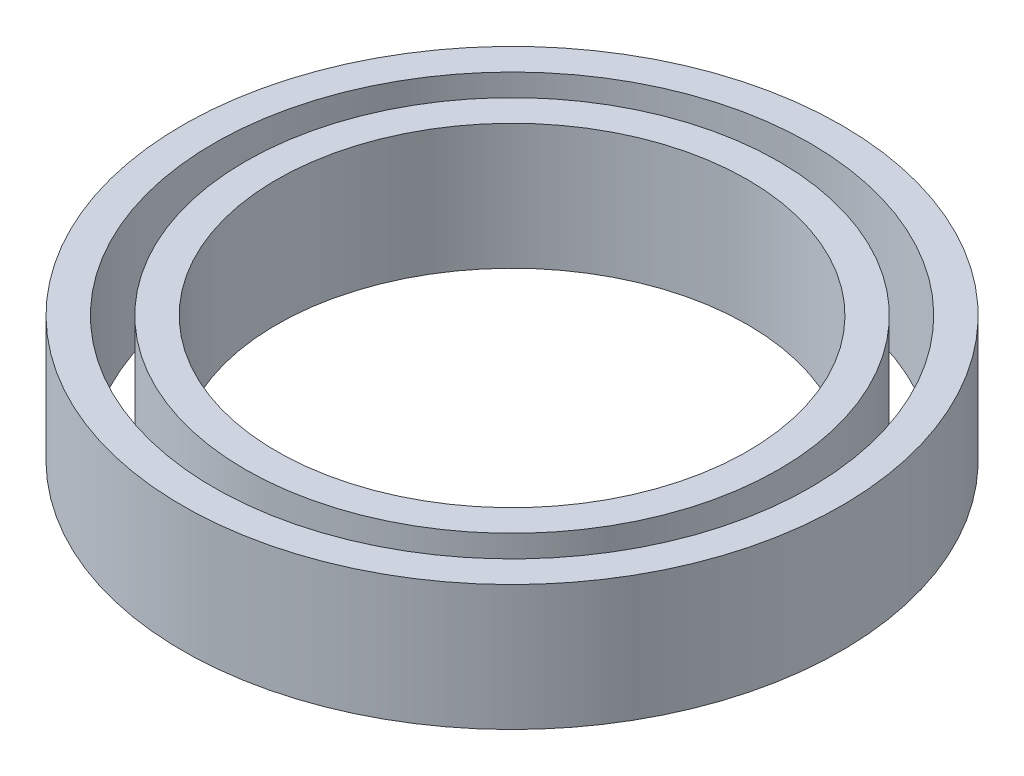
ISO-10303-21;
HEADER;
FILE_DESCRIPTION(('STEP AP214'),'2;1');
FILE_NAME('part.step','',(''),(''),'','','');
FILE_SCHEMA(('AUTOMOTIVE_DESIGN { 1 0 10303 214 1 1 1 1 }'));
ENDSEC;
DATA;
#1=APPLICATION_CONTEXT('core data for automotive mechanical design processes');
#2=APPLICATION_PROTOCOL_DEFINITION('international standard','automotive_design',2000,#1);
#3=PRODUCT_CONTEXT('',#1,'mechanical');
#4=PRODUCT('Part','Part','',(#3));
#5=PRODUCT_RELATED_PRODUCT_CATEGORY('part','',(#4));
#6=PRODUCT_DEFINITION_FORMATION('','',#4);
#7=PRODUCT_DEFINITION_CONTEXT('part definition',#1,'design');
#8=PRODUCT_DEFINITION('design','',#6,#7);
#9=PRODUCT_DEFINITION_SHAPE('','',#8);
#10=(LENGTH_UNIT() NAMED_UNIT(*) SI_UNIT(.MILLI.,.METRE.));
#11=(NAMED_UNIT(*) PLANE_ANGLE_UNIT() SI_UNIT($,.RADIAN.));
#12=(NAMED_UNIT(*) SI_UNIT($,.STERADIAN.) SOLID_ANGLE_UNIT());
#13=UNCERTAINTY_MEASURE_WITH_UNIT(LENGTH_MEASURE(1.E-05),#10,'distance_accuracy_value','');
#14=(GEOMETRIC_REPRESENTATION_CONTEXT(3) GLOBAL_UNCERTAINTY_ASSIGNED_CONTEXT((#13)) GLOBAL_UNIT_ASSIGNED_CONTEXT((#10,
#11,#12)) REPRESENTATION_CONTEXT('',''));
#15=CARTESIAN_POINT('',(0.,0.,0.));
#16=DIRECTION('',(0.,0.,1.));
#17=DIRECTION('',(1.,0.,0.));
#18=AXIS2_PLACEMENT_3D('',#15,#16,#17);
#19=CARTESIAN_POINT('',(0.,0.,0.));
#20=DIRECTION('',(0.,-1.,0.));
#21=DIRECTION('',(0.,0.,-1.));
#22=AXIS2_PLACEMENT_3D('',#19,#20,#21);
#23=CYLINDRICAL_SURFACE('',#22,9.5);
#24=CARTESIAN_POINT('',(0.,0.,0.));
#25=DIRECTION('',(0.,-1.,0.));
#26=DIRECTION('',(0.,0.,-1.));
#27=AXIS2_PLACEMENT_3D('',#24,#25,#26);
#28=CIRCLE('',#27,9.5);
#29=CARTESIAN_POINT('',(0.,0.,-9.5));
#30=VERTEX_POINT('',#29);
#31=EDGE_CURVE('E59',#30,#30,#28,.T.);
#32=ORIENTED_EDGE('',*,*,#31,.T.);
#33=EDGE_LOOP('',(#32));
#34=FACE_BOUND('',#33,.T.);
#35=CARTESIAN_POINT('',(0.,4.,0.));
#36=DIRECTION('',(0.,-1.,0.));
#37=DIRECTION('',(0.,0.,-1.));
#38=AXIS2_PLACEMENT_3D('',#35,#36,#37);
#39=CIRCLE('',#38,9.5);
#40=CARTESIAN_POINT('',(0.,4.,-9.5));
#41=VERTEX_POINT('',#40);
#42=EDGE_CURVE('E11',#41,#41,#39,.T.);
#43=ORIENTED_EDGE('',*,*,#42,.F.);
#44=EDGE_LOOP('',(#43));
#45=FACE_BOUND('',#44,.T.);
#46=ADVANCED_FACE('F45',(#34,#45),#23,.F.);
#47=CARTESIAN_POINT('',(9.5,4.,0.));
#48=DIRECTION('',(0.,1.,0.));
#49=DIRECTION('',(0.,0.,1.));
#50=AXIS2_PLACEMENT_3D('',#47,#48,#49);
#51=PLANE('',#50);
#52=ORIENTED_EDGE('',*,*,#42,.T.);
#53=EDGE_LOOP('',(#52));
#54=FACE_BOUND('',#53,.T.);
#55=CARTESIAN_POINT('',(0.,4.,0.));
#56=DIRECTION('',(0.,-1.,0.));
#57=DIRECTION('',(0.,0.,-1.));
#58=AXIS2_PLACEMENT_3D('',#55,#56,#57);
#59=CIRCLE('',#58,10.5);
#60=CARTESIAN_POINT('',(0.,4.,-10.5));
#61=VERTEX_POINT('',#60);
#62=EDGE_CURVE('E51',#61,#61,#59,.T.);
#63=ORIENTED_EDGE('',*,*,#62,.F.);
#64=EDGE_LOOP('',(#63));
#65=FACE_BOUND('',#64,.T.);
#66=ADVANCED_FACE('F75',(#54,#65),#51,.T.);
#67=CARTESIAN_POINT('',(0.,0.,0.));
#68=DIRECTION('',(0.,-1.,0.));
#69=DIRECTION('',(0.,0.,-1.));
#70=AXIS2_PLACEMENT_3D('',#67,#68,#69);
#71=CYLINDRICAL_SURFACE('',#70,10.5);
#72=ORIENTED_EDGE('',*,*,#62,.T.);
#73=EDGE_LOOP('',(#72));
#74=FACE_BOUND('',#73,.T.);
#75=CARTESIAN_POINT('',(0.,0.,0.));
#76=DIRECTION('',(0.,-1.,0.));
#77=DIRECTION('',(0.,0.,-1.));
#78=AXIS2_PLACEMENT_3D('',#75,#76,#77);
#79=CIRCLE('',#78,10.5);
#80=CARTESIAN_POINT('',(0.,0.,-10.5));
#81=VERTEX_POINT('',#80);
#82=EDGE_CURVE('E55',#81,#81,#79,.T.);
#83=ORIENTED_EDGE('',*,*,#82,.F.);
#84=EDGE_LOOP('',(#83));
#85=FACE_BOUND('',#84,.T.);
#86=ADVANCED_FACE('F69',(#74,#85),#71,.T.);
#87=CARTESIAN_POINT('',(9.5,0.,0.));
#88=DIRECTION('',(0.,-1.,0.));
#89=DIRECTION('',(0.,0.,-1.));
#90=AXIS2_PLACEMENT_3D('',#87,#88,#89);
#91=PLANE('',#90);
#92=ORIENTED_EDGE('',*,*,#82,.T.);
#93=EDGE_LOOP('',(#92));
#94=FACE_BOUND('',#93,.T.);
#95=ORIENTED_EDGE('',*,*,#31,.F.);
#96=EDGE_LOOP('',(#95));
#97=FACE_BOUND('',#96,.T.);
#98=ADVANCED_FACE('F67',(#94,#97),#91,.T.);
#99=CLOSED_SHELL('',(#46,#66,#86,#98));
#100=MANIFOLD_SOLID_BREP('B2',#99);
#101=CARTESIAN_POINT('',(0.,0.,0.));
#102=DIRECTION('',(0.,-1.,0.));
#103=DIRECTION('',(0.,0.,-1.));
#104=AXIS2_PLACEMENT_3D('',#101,#102,#103);
#105=CYLINDRICAL_SURFACE('',#104,7.5);
#106=CARTESIAN_POINT('',(0.,0.,0.));
#107=DIRECTION('',(0.,-1.,0.));
#108=DIRECTION('',(0.,0.,-1.));
#109=AXIS2_PLACEMENT_3D('',#106,#107,#108);
#110=CIRCLE('',#109,7.5);
#111=CARTESIAN_POINT('',(0.,0.,-7.5));
#112=VERTEX_POINT('',#111);
#113=EDGE_CURVE('E121',#112,#112,#110,.T.);
#114=ORIENTED_EDGE('',*,*,#113,.T.);
#115=EDGE_LOOP('',(#114));
#116=FACE_BOUND('',#115,.T.);
#117=CARTESIAN_POINT('',(0.,4.,0.));
#118=DIRECTION('',(0.,-1.,0.));
#119=DIRECTION('',(0.,0.,-1.));
#120=AXIS2_PLACEMENT_3D('',#117,#118,#119);
#121=CIRCLE('',#120,7.5);
#122=CARTESIAN_POINT('',(0.,4.,-7.5));
#123=VERTEX_POINT('',#122);
#124=EDGE_CURVE('E44',#123,#123,#121,.T.);
#125=ORIENTED_EDGE('',*,*,#124,.F.);
#126=EDGE_LOOP('',(#125));
#127=FACE_BOUND('',#126,.T.);
#128=ADVANCED_FACE('F107',(#116,#127),#105,.F.);
#129=CARTESIAN_POINT('',(7.5,4.,0.));
#130=DIRECTION('',(0.,1.,0.));
#131=DIRECTION('',(0.,0.,1.));
#132=AXIS2_PLACEMENT_3D('',#129,#130,#131);
#133=PLANE('',#132);
#134=ORIENTED_EDGE('',*,*,#124,.T.);
#135=EDGE_LOOP('',(#134));
#136=FACE_BOUND('',#135,.T.);
#137=CARTESIAN_POINT('',(0.,4.,0.));
#138=DIRECTION('',(0.,-1.,0.));
#139=DIRECTION('',(0.,0.,-1.));
#140=AXIS2_PLACEMENT_3D('',#137,#138,#139);
#141=CIRCLE('',#140,8.5);
#142=CARTESIAN_POINT('',(0.,4.,-8.5));
#143=VERTEX_POINT('',#142);
#144=EDGE_CURVE('E113',#143,#143,#141,.T.);
#145=ORIENTED_EDGE('',*,*,#144,.F.);
#146=EDGE_LOOP('',(#145));
#147=FACE_BOUND('',#146,.T.);
#148=ADVANCED_FACE('F137',(#136,#147),#133,.T.);
#149=CARTESIAN_POINT('',(0.,0.,0.));
#150=DIRECTION('',(0.,-1.,0.));
#151=DIRECTION('',(0.,0.,-1.));
#152=AXIS2_PLACEMENT_3D('',#149,#150,#151);
#153=CYLINDRICAL_SURFACE('',#152,8.5);
#154=ORIENTED_EDGE('',*,*,#144,.T.);
#155=EDGE_LOOP('',(#154));
#156=FACE_BOUND('',#155,.T.);
#157=CARTESIAN_POINT('',(0.,0.,0.));
#158=DIRECTION('',(0.,-1.,0.));
#159=DIRECTION('',(0.,0.,-1.));
#160=AXIS2_PLACEMENT_3D('',#157,#158,#159);
#161=CIRCLE('',#160,8.5);
#162=CARTESIAN_POINT('',(0.,0.,-8.5));
#163=VERTEX_POINT('',#162);
#164=EDGE_CURVE('E117',#163,#163,#161,.T.);
#165=ORIENTED_EDGE('',*,*,#164,.F.);
#166=EDGE_LOOP('',(#165));
#167=FACE_BOUND('',#166,.T.);
#168=ADVANCED_FACE('F131',(#156,#167),#153,.T.);
#169=CARTESIAN_POINT('',(7.5,0.,0.));
#170=DIRECTION('',(0.,-1.,0.));
#171=DIRECTION('',(0.,0.,-1.));
#172=AXIS2_PLACEMENT_3D('',#169,#170,#171);
#173=PLANE('',#172);
#174=ORIENTED_EDGE('',*,*,#164,.T.);
#175=EDGE_LOOP('',(#174));
#176=FACE_BOUND('',#175,.T.);
#177=ORIENTED_EDGE('',*,*,#113,.F.);
#178=EDGE_LOOP('',(#177));
#179=FACE_BOUND('',#178,.T.);
#180=ADVANCED_FACE('F129',(#176,#179),#173,.T.);
#181=CLOSED_SHELL('',(#128,#148,#168,#180));
#182=MANIFOLD_SOLID_BREP('B6',#181);
#183=ADVANCED_BREP_SHAPE_REPRESENTATION('',(#18,#100,#182),#14);
#184=SHAPE_DEFINITION_REPRESENTATION(#9,#183);
ENDSEC;
END-ISO-10303-21;
